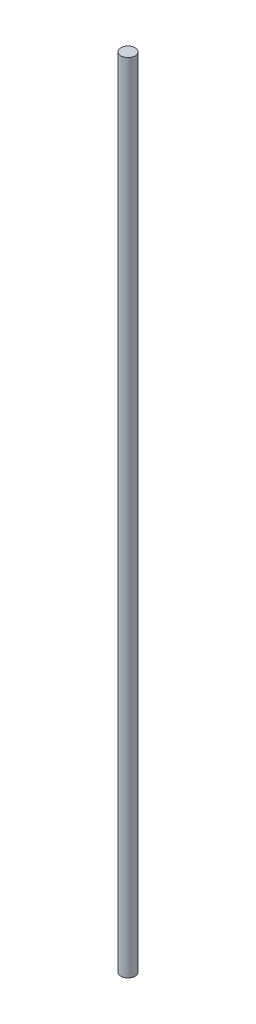
ISO-10303-21;
HEADER;
FILE_DESCRIPTION(('STEP AP214'),'2;1');
FILE_NAME('part.step','',(''),(''),'','','');
FILE_SCHEMA(('AUTOMOTIVE_DESIGN { 1 0 10303 214 1 1 1 1 }'));
ENDSEC;
DATA;
#1=APPLICATION_CONTEXT('core data for automotive mechanical design processes');
#2=APPLICATION_PROTOCOL_DEFINITION('international standard','automotive_design',2000,#1);
#3=PRODUCT_CONTEXT('',#1,'mechanical');
#4=PRODUCT('Part','Part','',(#3));
#5=PRODUCT_RELATED_PRODUCT_CATEGORY('part','',(#4));
#6=PRODUCT_DEFINITION_FORMATION('','',#4);
#7=PRODUCT_DEFINITION_CONTEXT('part definition',#1,'design');
#8=PRODUCT_DEFINITION('design','',#6,#7);
#9=PRODUCT_DEFINITION_SHAPE('','',#8);
#10=(LENGTH_UNIT() NAMED_UNIT(*) SI_UNIT(.MILLI.,.METRE.));
#11=(NAMED_UNIT(*) PLANE_ANGLE_UNIT() SI_UNIT($,.RADIAN.));
#12=(NAMED_UNIT(*) SI_UNIT($,.STERADIAN.) SOLID_ANGLE_UNIT());
#13=UNCERTAINTY_MEASURE_WITH_UNIT(LENGTH_MEASURE(1.E-05),#10,'distance_accuracy_value','');
#14=(GEOMETRIC_REPRESENTATION_CONTEXT(3) GLOBAL_UNCERTAINTY_ASSIGNED_CONTEXT((#13)) GLOBAL_UNIT_ASSIGNED_CONTEXT((#10,
#11,#12)) REPRESENTATION_CONTEXT('',''));
#15=CARTESIAN_POINT('',(0.,0.,0.));
#16=DIRECTION('',(0.,0.,1.));
#17=DIRECTION('',(1.,0.,0.));
#18=AXIS2_PLACEMENT_3D('',#15,#16,#17);
#19=CARTESIAN_POINT('',(0.,450.,0.));
#20=DIRECTION('',(0.,-1.,0.));
#21=DIRECTION('',(0.,0.,-1.));
#22=AXIS2_PLACEMENT_3D('',#19,#20,#21);
#23=CYLINDRICAL_SURFACE('',#22,4.);
#24=CARTESIAN_POINT('',(0.,450.,0.));
#25=DIRECTION('',(0.,1.,0.));
#26=DIRECTION('',(0.,0.,1.));
#27=AXIS2_PLACEMENT_3D('',#24,#25,#26);
#28=CIRCLE('',#27,4.);
#29=CARTESIAN_POINT('',(0.,450.,4.));
#30=VERTEX_POINT('',#29);
#31=EDGE_CURVE('E10',#30,#30,#28,.T.);
#32=ORIENTED_EDGE('',*,*,#31,.F.);
#33=EDGE_LOOP('',(#32));
#34=FACE_BOUND('',#33,.T.);
#35=CARTESIAN_POINT('',(0.,0.,0.));
#36=DIRECTION('',(0.,1.,0.));
#37=DIRECTION('',(0.,0.,1.));
#38=AXIS2_PLACEMENT_3D('',#35,#36,#37);
#39=CIRCLE('',#38,4.);
#40=CARTESIAN_POINT('',(0.,0.,4.));
#41=VERTEX_POINT('',#40);
#42=EDGE_CURVE('E34',#41,#41,#39,.T.);
#43=ORIENTED_EDGE('',*,*,#42,.T.);
#44=EDGE_LOOP('',(#43));
#45=FACE_BOUND('',#44,.T.);
#46=ADVANCED_FACE('F31',(#34,#45),#23,.T.);
#47=CARTESIAN_POINT('',(0.,450.,0.));
#48=DIRECTION('',(0.,1.,0.));
#49=DIRECTION('',(0.,0.,1.));
#50=AXIS2_PLACEMENT_3D('',#47,#48,#49);
#51=PLANE('',#50);
#52=ORIENTED_EDGE('',*,*,#31,.T.);
#53=EDGE_LOOP('',(#52));
#54=FACE_BOUND('',#53,.T.);
#55=ADVANCED_FACE('F46',(#54),#51,.T.);
#56=CARTESIAN_POINT('',(0.,0.,0.));
#57=DIRECTION('',(0.,1.,0.));
#58=DIRECTION('',(0.,0.,1.));
#59=AXIS2_PLACEMENT_3D('',#56,#57,#58);
#60=PLANE('',#59);
#61=ORIENTED_EDGE('',*,*,#42,.F.);
#62=EDGE_LOOP('',(#61));
#63=FACE_BOUND('',#62,.T.);
#64=ADVANCED_FACE('F44',(#63),#60,.F.);
#65=CLOSED_SHELL('',(#46,#55,#64));
#66=MANIFOLD_SOLID_BREP('B2',#65);
#67=ADVANCED_BREP_SHAPE_REPRESENTATION('',(#18,#66),#14);
#68=SHAPE_DEFINITION_REPRESENTATION(#9,#67);
ENDSEC;
END-ISO-10303-21;
